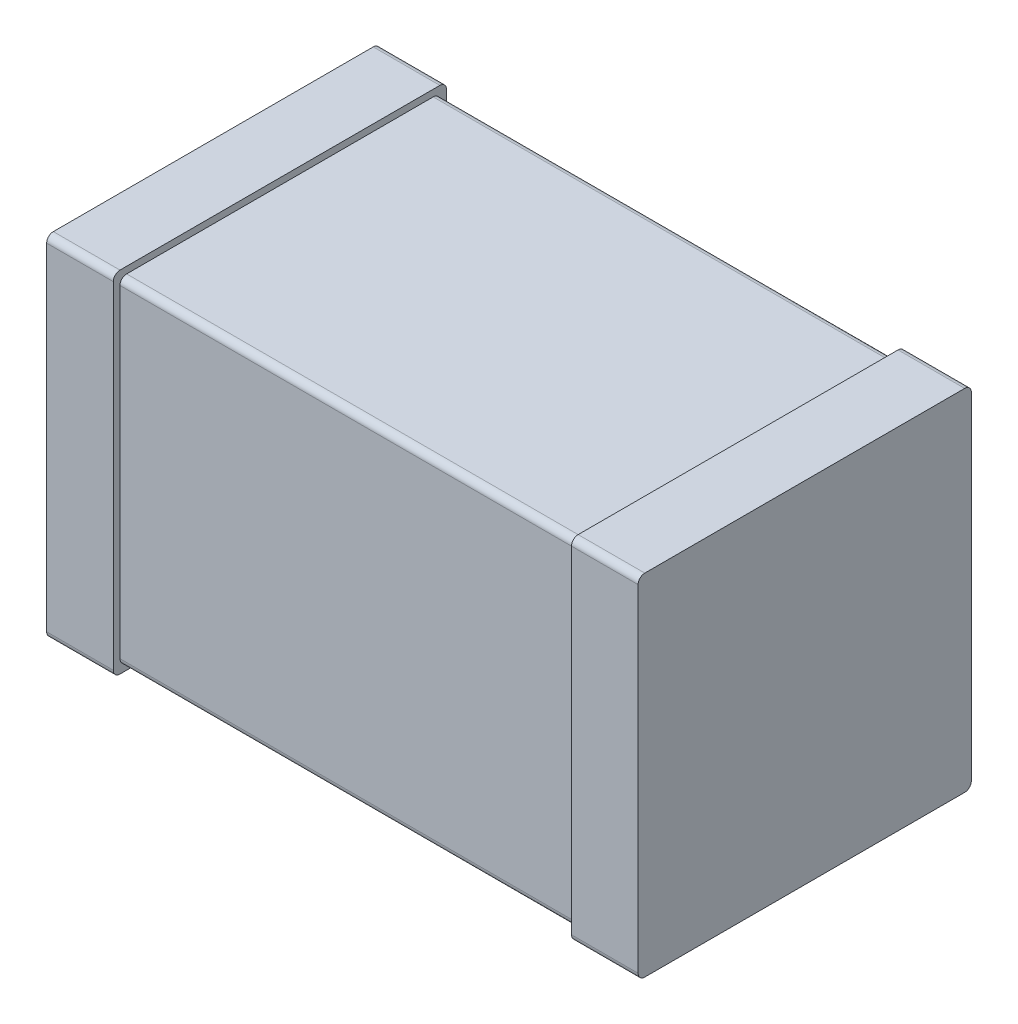
ISO-10303-21;
HEADER;
FILE_DESCRIPTION(('STEP AP214'),'2;1');
FILE_NAME('part.step','',(''),(''),'','','');
FILE_SCHEMA(('AUTOMOTIVE_DESIGN { 1 0 10303 214 1 1 1 1 }'));
ENDSEC;
DATA;
#1=APPLICATION_CONTEXT('core data for automotive mechanical design processes');
#2=APPLICATION_PROTOCOL_DEFINITION('international standard','automotive_design',2000,#1);
#3=PRODUCT_CONTEXT('',#1,'mechanical');
#4=PRODUCT('Part','Part','',(#3));
#5=PRODUCT_RELATED_PRODUCT_CATEGORY('part','',(#4));
#6=PRODUCT_DEFINITION_FORMATION('','',#4);
#7=PRODUCT_DEFINITION_CONTEXT('part definition',#1,'design');
#8=PRODUCT_DEFINITION('design','',#6,#7);
#9=PRODUCT_DEFINITION_SHAPE('','',#8);
#10=(LENGTH_UNIT() NAMED_UNIT(*) SI_UNIT(.MILLI.,.METRE.));
#11=(NAMED_UNIT(*) PLANE_ANGLE_UNIT() SI_UNIT($,.RADIAN.));
#12=(NAMED_UNIT(*) SI_UNIT($,.STERADIAN.) SOLID_ANGLE_UNIT());
#13=UNCERTAINTY_MEASURE_WITH_UNIT(LENGTH_MEASURE(1.E-05),#10,'distance_accuracy_value','');
#14=(GEOMETRIC_REPRESENTATION_CONTEXT(3) GLOBAL_UNCERTAINTY_ASSIGNED_CONTEXT((#13)) GLOBAL_UNIT_ASSIGNED_CONTEXT((#10,
#11,#12)) REPRESENTATION_CONTEXT('',''));
#15=CARTESIAN_POINT('',(0.,0.,0.));
#16=DIRECTION('',(0.,0.,1.));
#17=DIRECTION('',(1.,0.,0.));
#18=AXIS2_PLACEMENT_3D('',#15,#16,#17);
#19=CARTESIAN_POINT('',(-3.55,-2.1,0.));
#20=DIRECTION('',(1.,0.,0.));
#21=DIRECTION('',(0.,0.,-1.));
#22=AXIS2_PLACEMENT_3D('',#19,#20,#21);
#23=PLANE('',#22);
#24=DIRECTION('',(0.,1.,0.));
#25=VECTOR('',#24,1.);
#26=CARTESIAN_POINT('',(-3.55,-2.1,4.));
#27=LINE('',#26,#25);
#28=CARTESIAN_POINT('',(-3.55,2.02,4.));
#29=VERTEX_POINT('',#28);
#30=CARTESIAN_POINT('',(-3.55,-2.02,4.));
#31=VERTEX_POINT('',#30);
#32=EDGE_CURVE('E200',#29,#31,#27,.F.);
#33=ORIENTED_EDGE('',*,*,#32,.F.);
#34=CARTESIAN_POINT('',(-3.55,2.02,3.92));
#35=DIRECTION('',(1.,0.,0.));
#36=DIRECTION('',(0.,0.,-1.));
#37=AXIS2_PLACEMENT_3D('',#34,#35,#36);
#38=CIRCLE('',#37,0.08);
#39=CARTESIAN_POINT('',(-3.55,2.1,3.92));
#40=VERTEX_POINT('',#39);
#41=EDGE_CURVE('E209',#40,#29,#38,.T.);
#42=ORIENTED_EDGE('',*,*,#41,.F.);
#43=DIRECTION('',(0.,0.,1.));
#44=VECTOR('',#43,1.);
#45=CARTESIAN_POINT('',(-3.55,2.1,0.));
#46=LINE('',#45,#44);
#47=CARTESIAN_POINT('',(-3.55,2.1,0.08));
#48=VERTEX_POINT('',#47);
#49=EDGE_CURVE('E213',#48,#40,#46,.T.);
#50=ORIENTED_EDGE('',*,*,#49,.F.);
#51=CARTESIAN_POINT('',(-3.55,2.02,0.08));
#52=DIRECTION('',(1.,0.,0.));
#53=DIRECTION('',(0.,0.,-1.));
#54=AXIS2_PLACEMENT_3D('',#51,#52,#53);
#55=CIRCLE('',#54,0.08);
#56=CARTESIAN_POINT('',(-3.55,2.02,0.));
#57=VERTEX_POINT('',#56);
#58=EDGE_CURVE('E214',#57,#48,#55,.T.);
#59=ORIENTED_EDGE('',*,*,#58,.F.);
#60=DIRECTION('',(0.,1.,0.));
#61=VECTOR('',#60,1.);
#62=CARTESIAN_POINT('',(-3.55,-2.1,0.));
#63=LINE('',#62,#61);
#64=CARTESIAN_POINT('',(-3.55,-2.02,0.));
#65=VERTEX_POINT('',#64);
#66=EDGE_CURVE('E221',#57,#65,#63,.F.);
#67=ORIENTED_EDGE('',*,*,#66,.T.);
#68=CARTESIAN_POINT('',(-3.55,-2.02,0.08));
#69=DIRECTION('',(1.,0.,0.));
#70=DIRECTION('',(0.,0.,-1.));
#71=AXIS2_PLACEMENT_3D('',#68,#69,#70);
#72=CIRCLE('',#71,0.08);
#73=CARTESIAN_POINT('',(-3.55,-2.1,0.08));
#74=VERTEX_POINT('',#73);
#75=EDGE_CURVE('E186',#74,#65,#72,.T.);
#76=ORIENTED_EDGE('',*,*,#75,.F.);
#77=DIRECTION('',(0.,0.,1.));
#78=VECTOR('',#77,1.);
#79=CARTESIAN_POINT('',(-3.55,-2.1,0.));
#80=LINE('',#79,#78);
#81=CARTESIAN_POINT('',(-3.55,-2.1,3.92));
#82=VERTEX_POINT('',#81);
#83=EDGE_CURVE('E184',#74,#82,#80,.T.);
#84=ORIENTED_EDGE('',*,*,#83,.T.);
#85=CARTESIAN_POINT('',(-3.55,-2.02,3.92));
#86=DIRECTION('',(1.,0.,0.));
#87=DIRECTION('',(0.,0.,-1.));
#88=AXIS2_PLACEMENT_3D('',#85,#86,#87);
#89=CIRCLE('',#88,0.08);
#90=EDGE_CURVE('E20',#31,#82,#89,.T.);
#91=ORIENTED_EDGE('',*,*,#90,.F.);
#92=EDGE_LOOP('',(#33,#42,#50,#59,#67,#76,#84,#91));
#93=FACE_BOUND('',#92,.T.);
#94=ADVANCED_FACE('F17',(#93),#23,.F.);
#95=CARTESIAN_POINT('',(3.55,-2.1,0.));
#96=DIRECTION('',(1.,0.,0.));
#97=DIRECTION('',(0.,0.,-1.));
#98=AXIS2_PLACEMENT_3D('',#95,#96,#97);
#99=PLANE('',#98);
#100=DIRECTION('',(0.,1.,0.));
#101=VECTOR('',#100,1.);
#102=CARTESIAN_POINT('',(3.55,-2.1,4.));
#103=LINE('',#102,#101);
#104=CARTESIAN_POINT('',(3.55,-2.02,4.));
#105=VERTEX_POINT('',#104);
#106=CARTESIAN_POINT('',(3.55,2.02,4.));
#107=VERTEX_POINT('',#106);
#108=EDGE_CURVE('E224',#105,#107,#103,.T.);
#109=ORIENTED_EDGE('',*,*,#108,.F.);
#110=CARTESIAN_POINT('',(3.55,-2.02,3.92));
#111=DIRECTION('',(1.,0.,0.));
#112=DIRECTION('',(0.,0.,-1.));
#113=AXIS2_PLACEMENT_3D('',#110,#111,#112);
#114=CIRCLE('',#113,0.08);
#115=CARTESIAN_POINT('',(3.55,-2.1,3.92));
#116=VERTEX_POINT('',#115);
#117=EDGE_CURVE('E182',#105,#116,#114,.T.);
#118=ORIENTED_EDGE('',*,*,#117,.T.);
#119=DIRECTION('',(0.,0.,1.));
#120=VECTOR('',#119,1.);
#121=CARTESIAN_POINT('',(3.55,-2.1,0.));
#122=LINE('',#121,#120);
#123=CARTESIAN_POINT('',(3.55,-2.1,0.08));
#124=VERTEX_POINT('',#123);
#125=EDGE_CURVE('E197',#116,#124,#122,.F.);
#126=ORIENTED_EDGE('',*,*,#125,.T.);
#127=CARTESIAN_POINT('',(3.55,-2.02,0.08));
#128=DIRECTION('',(1.,0.,0.));
#129=DIRECTION('',(0.,0.,-1.));
#130=AXIS2_PLACEMENT_3D('',#127,#128,#129);
#131=CIRCLE('',#130,0.08);
#132=CARTESIAN_POINT('',(3.55,-2.02,0.));
#133=VERTEX_POINT('',#132);
#134=EDGE_CURVE('E230',#133,#124,#131,.F.);
#135=ORIENTED_EDGE('',*,*,#134,.F.);
#136=DIRECTION('',(0.,1.,0.));
#137=VECTOR('',#136,1.);
#138=CARTESIAN_POINT('',(3.55,-2.1,0.));
#139=LINE('',#138,#137);
#140=CARTESIAN_POINT('',(3.55,2.02,0.));
#141=VERTEX_POINT('',#140);
#142=EDGE_CURVE('E235',#133,#141,#139,.T.);
#143=ORIENTED_EDGE('',*,*,#142,.T.);
#144=CARTESIAN_POINT('',(3.55,2.02,0.08));
#145=DIRECTION('',(1.,0.,0.));
#146=DIRECTION('',(0.,0.,-1.));
#147=AXIS2_PLACEMENT_3D('',#144,#145,#146);
#148=CIRCLE('',#147,0.08);
#149=CARTESIAN_POINT('',(3.55,2.1,0.08));
#150=VERTEX_POINT('',#149);
#151=EDGE_CURVE('E238',#150,#141,#148,.F.);
#152=ORIENTED_EDGE('',*,*,#151,.F.);
#153=DIRECTION('',(0.,0.,1.));
#154=VECTOR('',#153,1.);
#155=CARTESIAN_POINT('',(3.55,2.1,0.));
#156=LINE('',#155,#154);
#157=CARTESIAN_POINT('',(3.55,2.1,3.92));
#158=VERTEX_POINT('',#157);
#159=EDGE_CURVE('E231',#158,#150,#156,.F.);
#160=ORIENTED_EDGE('',*,*,#159,.F.);
#161=CARTESIAN_POINT('',(3.55,2.02,3.92));
#162=DIRECTION('',(1.,0.,0.));
#163=DIRECTION('',(0.,0.,-1.));
#164=AXIS2_PLACEMENT_3D('',#161,#162,#163);
#165=CIRCLE('',#164,0.08);
#166=EDGE_CURVE('E285',#107,#158,#165,.F.);
#167=ORIENTED_EDGE('',*,*,#166,.F.);
#168=EDGE_LOOP('',(#109,#118,#126,#135,#143,#152,#160,#167));
#169=FACE_BOUND('',#168,.T.);
#170=ADVANCED_FACE('F301',(#169),#99,.T.);
#171=CARTESIAN_POINT('',(-2.75,-1.94,3.84));
#172=DIRECTION('',(1.,0.,0.));
#173=DIRECTION('',(0.,0.,-1.));
#174=AXIS2_PLACEMENT_3D('',#171,#172,#173);
#175=CYLINDRICAL_SURFACE('',#174,0.08);
#176=DIRECTION('',(1.,0.,0.));
#177=VECTOR('',#176,1.);
#178=CARTESIAN_POINT('',(-2.75,-1.94,3.92));
#179=LINE('',#178,#177);
#180=CARTESIAN_POINT('',(-2.75,-1.94,3.92));
#181=VERTEX_POINT('',#180);
#182=CARTESIAN_POINT('',(2.75,-1.94,3.92));
#183=VERTEX_POINT('',#182);
#184=EDGE_CURVE('E362',#181,#183,#179,.T.);
#185=ORIENTED_EDGE('',*,*,#184,.F.);
#186=CARTESIAN_POINT('',(-2.75,-1.94,3.84));
#187=DIRECTION('',(1.,0.,0.));
#188=DIRECTION('',(0.,0.,-1.));
#189=AXIS2_PLACEMENT_3D('',#186,#187,#188);
#190=CIRCLE('',#189,0.08);
#191=CARTESIAN_POINT('',(-2.75,-2.02,3.84));
#192=VERTEX_POINT('',#191);
#193=EDGE_CURVE('E295',#181,#192,#190,.T.);
#194=ORIENTED_EDGE('',*,*,#193,.T.);
#195=DIRECTION('',(1.,0.,0.));
#196=VECTOR('',#195,1.);
#197=CARTESIAN_POINT('',(-2.75,-2.02,3.84));
#198=LINE('',#197,#196);
#199=CARTESIAN_POINT('',(2.75,-2.02,3.84));
#200=VERTEX_POINT('',#199);
#201=EDGE_CURVE('E316',#192,#200,#198,.T.);
#202=ORIENTED_EDGE('',*,*,#201,.T.);
#203=CARTESIAN_POINT('',(2.75,-1.94,3.84));
#204=DIRECTION('',(1.,0.,0.));
#205=DIRECTION('',(0.,0.,-1.));
#206=AXIS2_PLACEMENT_3D('',#203,#204,#205);
#207=CIRCLE('',#206,0.08);
#208=EDGE_CURVE('E297',#200,#183,#207,.F.);
#209=ORIENTED_EDGE('',*,*,#208,.T.);
#210=EDGE_LOOP('',(#185,#194,#202,#209));
#211=FACE_BOUND('',#210,.T.);
#212=ADVANCED_FACE('F372',(#211),#175,.T.);
#213=CARTESIAN_POINT('',(-2.75,1.94,3.84));
#214=DIRECTION('',(1.,0.,0.));
#215=DIRECTION('',(0.,0.,-1.));
#216=AXIS2_PLACEMENT_3D('',#213,#214,#215);
#217=CYLINDRICAL_SURFACE('',#216,0.08);
#218=CARTESIAN_POINT('',(2.75,1.94,3.84));
#219=DIRECTION('',(1.,0.,0.));
#220=DIRECTION('',(0.,0.,-1.));
#221=AXIS2_PLACEMENT_3D('',#218,#219,#220);
#222=CIRCLE('',#221,0.08);
#223=CARTESIAN_POINT('',(2.75,1.94,3.92));
#224=VERTEX_POINT('',#223);
#225=CARTESIAN_POINT('',(2.75,2.02,3.84));
#226=VERTEX_POINT('',#225);
#227=EDGE_CURVE('E190',#224,#226,#222,.F.);
#228=ORIENTED_EDGE('',*,*,#227,.T.);
#229=DIRECTION('',(1.,0.,0.));
#230=VECTOR('',#229,1.);
#231=CARTESIAN_POINT('',(-2.75,2.02,3.84));
#232=LINE('',#231,#230);
#233=CARTESIAN_POINT('',(-2.75,2.02,3.84));
#234=VERTEX_POINT('',#233);
#235=EDGE_CURVE('E356',#234,#226,#232,.T.);
#236=ORIENTED_EDGE('',*,*,#235,.F.);
#237=CARTESIAN_POINT('',(-2.75,1.94,3.84));
#238=DIRECTION('',(1.,0.,0.));
#239=DIRECTION('',(0.,0.,-1.));
#240=AXIS2_PLACEMENT_3D('',#237,#238,#239);
#241=CIRCLE('',#240,0.08);
#242=CARTESIAN_POINT('',(-2.75,1.94,3.92));
#243=VERTEX_POINT('',#242);
#244=EDGE_CURVE('E293',#234,#243,#241,.T.);
#245=ORIENTED_EDGE('',*,*,#244,.T.);
#246=DIRECTION('',(1.,0.,0.));
#247=VECTOR('',#246,1.);
#248=CARTESIAN_POINT('',(-2.75,1.94,3.92));
#249=LINE('',#248,#247);
#250=EDGE_CURVE('E361',#224,#243,#249,.F.);
#251=ORIENTED_EDGE('',*,*,#250,.F.);
#252=EDGE_LOOP('',(#228,#236,#245,#251));
#253=FACE_BOUND('',#252,.T.);
#254=ADVANCED_FACE('F653',(#253),#217,.T.);
#255=CARTESIAN_POINT('',(-3.55,-2.1,0.));
#256=DIRECTION('',(0.,1.,0.));
#257=DIRECTION('',(0.,0.,1.));
#258=AXIS2_PLACEMENT_3D('',#255,#256,#257);
#259=PLANE('',#258);
#260=ORIENTED_EDGE('',*,*,#83,.F.);
#261=DIRECTION('',(1.,0.,0.));
#262=VECTOR('',#261,1.);
#263=CARTESIAN_POINT('',(-3.55,-2.1,0.08));
#264=LINE('',#263,#262);
#265=CARTESIAN_POINT('',(-2.75,-2.1,0.08));
#266=VERTEX_POINT('',#265);
#267=EDGE_CURVE('E222',#266,#74,#264,.F.);
#268=ORIENTED_EDGE('',*,*,#267,.F.);
#269=DIRECTION('',(0.,0.,-1.));
#270=VECTOR('',#269,1.);
#271=CARTESIAN_POINT('',(-2.75,-2.1,0.));
#272=LINE('',#271,#270);
#273=CARTESIAN_POINT('',(-2.75,-2.1,3.92));
#274=VERTEX_POINT('',#273);
#275=EDGE_CURVE('E194',#274,#266,#272,.T.);
#276=ORIENTED_EDGE('',*,*,#275,.F.);
#277=DIRECTION('',(1.,0.,0.));
#278=VECTOR('',#277,1.);
#279=CARTESIAN_POINT('',(-3.55,-2.1,3.92));
#280=LINE('',#279,#278);
#281=EDGE_CURVE('E178',#82,#274,#280,.T.);
#282=ORIENTED_EDGE('',*,*,#281,.F.);
#283=EDGE_LOOP('',(#260,#268,#276,#282));
#284=FACE_BOUND('',#283,.T.);
#285=ADVANCED_FACE('F193',(#284),#259,.F.);
#286=CARTESIAN_POINT('',(-3.55,-2.02,0.08));
#287=DIRECTION('',(1.,0.,0.));
#288=DIRECTION('',(0.,0.,-1.));
#289=AXIS2_PLACEMENT_3D('',#286,#287,#288);
#290=CYLINDRICAL_SURFACE('',#289,0.08);
#291=CARTESIAN_POINT('',(-2.75,-2.02,0.08));
#292=DIRECTION('',(1.,0.,0.));
#293=DIRECTION('',(0.,0.,-1.));
#294=AXIS2_PLACEMENT_3D('',#291,#292,#293);
#295=CIRCLE('',#294,0.08);
#296=CARTESIAN_POINT('',(-2.75,-2.02,0.));
#297=VERTEX_POINT('',#296);
#298=EDGE_CURVE('E283',#266,#297,#295,.T.);
#299=ORIENTED_EDGE('',*,*,#298,.F.);
#300=ORIENTED_EDGE('',*,*,#267,.T.);
#301=ORIENTED_EDGE('',*,*,#75,.T.);
#302=DIRECTION('',(1.,0.,0.));
#303=VECTOR('',#302,1.);
#304=CARTESIAN_POINT('',(-3.55,-2.02,0.));
#305=LINE('',#304,#303);
#306=EDGE_CURVE('E218',#65,#297,#305,.T.);
#307=ORIENTED_EDGE('',*,*,#306,.T.);
#308=EDGE_LOOP('',(#299,#300,#301,#307));
#309=FACE_BOUND('',#308,.T.);
#310=ADVANCED_FACE('F636',(#309),#290,.T.);
#311=CARTESIAN_POINT('',(-3.55,-2.1,0.));
#312=DIRECTION('',(0.,0.,1.));
#313=DIRECTION('',(1.,0.,0.));
#314=AXIS2_PLACEMENT_3D('',#311,#312,#313);
#315=PLANE('',#314);
#316=DIRECTION('',(0.,1.,0.));
#317=VECTOR('',#316,1.);
#318=CARTESIAN_POINT('',(-2.75,-2.1,0.));
#319=LINE('',#318,#317);
#320=CARTESIAN_POINT('',(-2.75,2.02,0.));
#321=VERTEX_POINT('',#320);
#322=EDGE_CURVE('E282',#297,#321,#319,.T.);
#323=ORIENTED_EDGE('',*,*,#322,.F.);
#324=ORIENTED_EDGE('',*,*,#306,.F.);
#325=ORIENTED_EDGE('',*,*,#66,.F.);
#326=DIRECTION('',(1.,0.,0.));
#327=VECTOR('',#326,1.);
#328=CARTESIAN_POINT('',(-3.55,2.02,0.));
#329=LINE('',#328,#327);
#330=EDGE_CURVE('E215',#321,#57,#329,.F.);
#331=ORIENTED_EDGE('',*,*,#330,.F.);
#332=EDGE_LOOP('',(#323,#324,#325,#331));
#333=FACE_BOUND('',#332,.T.);
#334=ADVANCED_FACE('F627',(#333),#315,.F.);
#335=CARTESIAN_POINT('',(-3.55,2.02,0.08));
#336=DIRECTION('',(1.,0.,0.));
#337=DIRECTION('',(0.,0.,-1.));
#338=AXIS2_PLACEMENT_3D('',#335,#336,#337);
#339=CYLINDRICAL_SURFACE('',#338,0.08);
#340=ORIENTED_EDGE('',*,*,#330,.T.);
#341=ORIENTED_EDGE('',*,*,#58,.T.);
#342=DIRECTION('',(1.,0.,0.));
#343=VECTOR('',#342,1.);
#344=CARTESIAN_POINT('',(-3.55,2.1,0.08));
#345=LINE('',#344,#343);
#346=CARTESIAN_POINT('',(-2.75,2.1,0.08));
#347=VERTEX_POINT('',#346);
#348=EDGE_CURVE('E210',#347,#48,#345,.F.);
#349=ORIENTED_EDGE('',*,*,#348,.F.);
#350=CARTESIAN_POINT('',(-2.75,2.02,0.08));
#351=DIRECTION('',(1.,0.,0.));
#352=DIRECTION('',(0.,0.,-1.));
#353=AXIS2_PLACEMENT_3D('',#350,#351,#352);
#354=CIRCLE('',#353,0.08);
#355=EDGE_CURVE('E280',#321,#347,#354,.T.);
#356=ORIENTED_EDGE('',*,*,#355,.F.);
#357=EDGE_LOOP('',(#340,#341,#349,#356));
#358=FACE_BOUND('',#357,.T.);
#359=ADVANCED_FACE('F618',(#358),#339,.T.);
#360=CARTESIAN_POINT('',(-3.55,2.1,0.));
#361=DIRECTION('',(0.,1.,0.));
#362=DIRECTION('',(0.,0.,1.));
#363=AXIS2_PLACEMENT_3D('',#360,#361,#362);
#364=PLANE('',#363);
#365=ORIENTED_EDGE('',*,*,#49,.T.);
#366=DIRECTION('',(1.,0.,0.));
#367=VECTOR('',#366,1.);
#368=CARTESIAN_POINT('',(-3.55,2.1,3.92));
#369=LINE('',#368,#367);
#370=CARTESIAN_POINT('',(-2.75,2.1,3.92));
#371=VERTEX_POINT('',#370);
#372=EDGE_CURVE('E206',#371,#40,#369,.F.);
#373=ORIENTED_EDGE('',*,*,#372,.F.);
#374=DIRECTION('',(0.,0.,-1.));
#375=VECTOR('',#374,1.);
#376=CARTESIAN_POINT('',(-2.75,2.1,0.));
#377=LINE('',#376,#375);
#378=EDGE_CURVE('E279',#347,#371,#377,.F.);
#379=ORIENTED_EDGE('',*,*,#378,.F.);
#380=ORIENTED_EDGE('',*,*,#348,.T.);
#381=EDGE_LOOP('',(#365,#373,#379,#380));
#382=FACE_BOUND('',#381,.T.);
#383=ADVANCED_FACE('F609',(#382),#364,.T.);
#384=CARTESIAN_POINT('',(-3.55,2.02,3.92));
#385=DIRECTION('',(1.,0.,0.));
#386=DIRECTION('',(0.,0.,-1.));
#387=AXIS2_PLACEMENT_3D('',#384,#385,#386);
#388=CYLINDRICAL_SURFACE('',#387,0.08);
#389=CARTESIAN_POINT('',(-2.75,2.02,3.92));
#390=DIRECTION('',(1.,0.,0.));
#391=DIRECTION('',(0.,0.,-1.));
#392=AXIS2_PLACEMENT_3D('',#389,#390,#391);
#393=CIRCLE('',#392,0.08);
#394=CARTESIAN_POINT('',(-2.75,2.02,4.));
#395=VERTEX_POINT('',#394);
#396=EDGE_CURVE('E277',#371,#395,#393,.T.);
#397=ORIENTED_EDGE('',*,*,#396,.F.);
#398=ORIENTED_EDGE('',*,*,#372,.T.);
#399=ORIENTED_EDGE('',*,*,#41,.T.);
#400=DIRECTION('',(1.,0.,0.));
#401=VECTOR('',#400,1.);
#402=CARTESIAN_POINT('',(-3.55,2.02,4.));
#403=LINE('',#402,#401);
#404=EDGE_CURVE('E195',#395,#29,#403,.F.);
#405=ORIENTED_EDGE('',*,*,#404,.F.);
#406=EDGE_LOOP('',(#397,#398,#399,#405));
#407=FACE_BOUND('',#406,.T.);
#408=ADVANCED_FACE('F600',(#407),#388,.T.);
#409=CARTESIAN_POINT('',(-3.55,-2.1,4.));
#410=DIRECTION('',(0.,0.,1.));
#411=DIRECTION('',(1.,0.,0.));
#412=AXIS2_PLACEMENT_3D('',#409,#410,#411);
#413=PLANE('',#412);
#414=DIRECTION('',(0.,1.,0.));
#415=VECTOR('',#414,1.);
#416=CARTESIAN_POINT('',(-2.75,-2.1,4.));
#417=LINE('',#416,#415);
#418=CARTESIAN_POINT('',(-2.75,-2.02,4.));
#419=VERTEX_POINT('',#418);
#420=EDGE_CURVE('E276',#395,#419,#417,.F.);
#421=ORIENTED_EDGE('',*,*,#420,.F.);
#422=ORIENTED_EDGE('',*,*,#404,.T.);
#423=ORIENTED_EDGE('',*,*,#32,.T.);
#424=DIRECTION('',(1.,0.,0.));
#425=VECTOR('',#424,1.);
#426=CARTESIAN_POINT('',(-3.55,-2.02,4.));
#427=LINE('',#426,#425);
#428=EDGE_CURVE('E181',#419,#31,#427,.F.);
#429=ORIENTED_EDGE('',*,*,#428,.F.);
#430=EDGE_LOOP('',(#421,#422,#423,#429));
#431=FACE_BOUND('',#430,.T.);
#432=ADVANCED_FACE('F592',(#431),#413,.T.);
#433=CARTESIAN_POINT('',(-3.55,-2.02,3.92));
#434=DIRECTION('',(1.,0.,0.));
#435=DIRECTION('',(0.,0.,-1.));
#436=AXIS2_PLACEMENT_3D('',#433,#434,#435);
#437=CYLINDRICAL_SURFACE('',#436,0.08);
#438=ORIENTED_EDGE('',*,*,#428,.T.);
#439=ORIENTED_EDGE('',*,*,#90,.T.);
#440=ORIENTED_EDGE('',*,*,#281,.T.);
#441=CARTESIAN_POINT('',(-2.75,-2.02,3.92));
#442=DIRECTION('',(1.,0.,0.));
#443=DIRECTION('',(0.,0.,-1.));
#444=AXIS2_PLACEMENT_3D('',#441,#442,#443);
#445=CIRCLE('',#444,0.08);
#446=EDGE_CURVE('E273',#419,#274,#445,.T.);
#447=ORIENTED_EDGE('',*,*,#446,.F.);
#448=EDGE_LOOP('',(#438,#439,#440,#447));
#449=FACE_BOUND('',#448,.T.);
#450=ADVANCED_FACE('F175',(#449),#437,.T.);
#451=CARTESIAN_POINT('',(2.75,-2.1,0.));
#452=DIRECTION('',(0.,1.,0.));
#453=DIRECTION('',(0.,0.,1.));
#454=AXIS2_PLACEMENT_3D('',#451,#452,#453);
#455=PLANE('',#454);
#456=DIRECTION('',(0.,0.,-1.));
#457=VECTOR('',#456,1.);
#458=CARTESIAN_POINT('',(2.75,-2.1,0.));
#459=LINE('',#458,#457);
#460=CARTESIAN_POINT('',(2.75,-2.1,3.92));
#461=VERTEX_POINT('',#460);
#462=CARTESIAN_POINT('',(2.75,-2.1,0.08));
#463=VERTEX_POINT('',#462);
#464=EDGE_CURVE('E268',#461,#463,#459,.T.);
#465=ORIENTED_EDGE('',*,*,#464,.T.);
#466=DIRECTION('',(1.,0.,0.));
#467=VECTOR('',#466,1.);
#468=CARTESIAN_POINT('',(2.75,-2.1,0.08));
#469=LINE('',#468,#467);
#470=EDGE_CURVE('E203',#124,#463,#469,.F.);
#471=ORIENTED_EDGE('',*,*,#470,.F.);
#472=ORIENTED_EDGE('',*,*,#125,.F.);
#473=DIRECTION('',(1.,0.,0.));
#474=VECTOR('',#473,1.);
#475=CARTESIAN_POINT('',(2.75,-2.1,3.92));
#476=LINE('',#475,#474);
#477=EDGE_CURVE('E311',#461,#116,#476,.T.);
#478=ORIENTED_EDGE('',*,*,#477,.F.);
#479=EDGE_LOOP('',(#465,#471,#472,#478));
#480=FACE_BOUND('',#479,.T.);
#481=ADVANCED_FACE('F310',(#480),#455,.F.);
#482=CARTESIAN_POINT('',(2.75,-2.02,0.08));
#483=DIRECTION('',(1.,0.,0.));
#484=DIRECTION('',(0.,0.,-1.));
#485=AXIS2_PLACEMENT_3D('',#482,#483,#484);
#486=CYLINDRICAL_SURFACE('',#485,0.08);
#487=ORIENTED_EDGE('',*,*,#134,.T.);
#488=ORIENTED_EDGE('',*,*,#470,.T.);
#489=CARTESIAN_POINT('',(2.75,-2.02,0.08));
#490=DIRECTION('',(1.,0.,0.));
#491=DIRECTION('',(0.,0.,-1.));
#492=AXIS2_PLACEMENT_3D('',#489,#490,#491);
#493=CIRCLE('',#492,0.08);
#494=CARTESIAN_POINT('',(2.75,-2.02,0.));
#495=VERTEX_POINT('',#494);
#496=EDGE_CURVE('E265',#463,#495,#493,.T.);
#497=ORIENTED_EDGE('',*,*,#496,.T.);
#498=DIRECTION('',(1.,0.,0.));
#499=VECTOR('',#498,1.);
#500=CARTESIAN_POINT('',(2.75,-2.02,0.));
#501=LINE('',#500,#499);
#502=EDGE_CURVE('E239',#495,#133,#501,.T.);
#503=ORIENTED_EDGE('',*,*,#502,.T.);
#504=EDGE_LOOP('',(#487,#488,#497,#503));
#505=FACE_BOUND('',#504,.T.);
#506=ADVANCED_FACE('F326',(#505),#486,.T.);
#507=CARTESIAN_POINT('',(2.75,-2.1,0.));
#508=DIRECTION('',(0.,0.,1.));
#509=DIRECTION('',(1.,0.,0.));
#510=AXIS2_PLACEMENT_3D('',#507,#508,#509);
#511=PLANE('',#510);
#512=ORIENTED_EDGE('',*,*,#142,.F.);
#513=ORIENTED_EDGE('',*,*,#502,.F.);
#514=DIRECTION('',(0.,1.,0.));
#515=VECTOR('',#514,1.);
#516=CARTESIAN_POINT('',(2.75,-2.1,0.));
#517=LINE('',#516,#515);
#518=CARTESIAN_POINT('',(2.75,2.02,0.));
#519=VERTEX_POINT('',#518);
#520=EDGE_CURVE('E264',#495,#519,#517,.T.);
#521=ORIENTED_EDGE('',*,*,#520,.T.);
#522=DIRECTION('',(1.,0.,0.));
#523=VECTOR('',#522,1.);
#524=CARTESIAN_POINT('',(2.75,2.02,0.));
#525=LINE('',#524,#523);
#526=EDGE_CURVE('E234',#141,#519,#525,.F.);
#527=ORIENTED_EDGE('',*,*,#526,.F.);
#528=EDGE_LOOP('',(#512,#513,#521,#527));
#529=FACE_BOUND('',#528,.T.);
#530=ADVANCED_FACE('F397',(#529),#511,.F.);
#531=CARTESIAN_POINT('',(2.75,2.02,0.08));
#532=DIRECTION('',(1.,0.,0.));
#533=DIRECTION('',(0.,0.,-1.));
#534=AXIS2_PLACEMENT_3D('',#531,#532,#533);
#535=CYLINDRICAL_SURFACE('',#534,0.08);
#536=ORIENTED_EDGE('',*,*,#526,.T.);
#537=CARTESIAN_POINT('',(2.75,2.02,0.08));
#538=DIRECTION('',(1.,0.,0.));
#539=DIRECTION('',(0.,0.,-1.));
#540=AXIS2_PLACEMENT_3D('',#537,#538,#539);
#541=CIRCLE('',#540,0.08);
#542=CARTESIAN_POINT('',(2.75,2.1,0.08));
#543=VERTEX_POINT('',#542);
#544=EDGE_CURVE('E261',#519,#543,#541,.T.);
#545=ORIENTED_EDGE('',*,*,#544,.T.);
#546=DIRECTION('',(1.,0.,0.));
#547=VECTOR('',#546,1.);
#548=CARTESIAN_POINT('',(2.75,2.1,0.08));
#549=LINE('',#548,#547);
#550=EDGE_CURVE('E233',#150,#543,#549,.F.);
#551=ORIENTED_EDGE('',*,*,#550,.F.);
#552=ORIENTED_EDGE('',*,*,#151,.T.);
#553=EDGE_LOOP('',(#536,#545,#551,#552));
#554=FACE_BOUND('',#553,.T.);
#555=ADVANCED_FACE('F392',(#554),#535,.T.);
#556=CARTESIAN_POINT('',(2.75,2.1,0.));
#557=DIRECTION('',(0.,1.,0.));
#558=DIRECTION('',(0.,0.,1.));
#559=AXIS2_PLACEMENT_3D('',#556,#557,#558);
#560=PLANE('',#559);
#561=DIRECTION('',(0.,0.,-1.));
#562=VECTOR('',#561,1.);
#563=CARTESIAN_POINT('',(2.75,2.1,0.));
#564=LINE('',#563,#562);
#565=CARTESIAN_POINT('',(2.75,2.1,3.92));
#566=VERTEX_POINT('',#565);
#567=EDGE_CURVE('E260',#543,#566,#564,.F.);
#568=ORIENTED_EDGE('',*,*,#567,.T.);
#569=DIRECTION('',(1.,0.,0.));
#570=VECTOR('',#569,1.);
#571=CARTESIAN_POINT('',(2.75,2.1,3.92));
#572=LINE('',#571,#570);
#573=EDGE_CURVE('E227',#158,#566,#572,.F.);
#574=ORIENTED_EDGE('',*,*,#573,.F.);
#575=ORIENTED_EDGE('',*,*,#159,.T.);
#576=ORIENTED_EDGE('',*,*,#550,.T.);
#577=EDGE_LOOP('',(#568,#574,#575,#576));
#578=FACE_BOUND('',#577,.T.);
#579=ADVANCED_FACE('F388',(#578),#560,.T.);
#580=CARTESIAN_POINT('',(2.75,2.02,3.92));
#581=DIRECTION('',(1.,0.,0.));
#582=DIRECTION('',(0.,0.,-1.));
#583=AXIS2_PLACEMENT_3D('',#580,#581,#582);
#584=CYLINDRICAL_SURFACE('',#583,0.08);
#585=ORIENTED_EDGE('',*,*,#166,.T.);
#586=ORIENTED_EDGE('',*,*,#573,.T.);
#587=CARTESIAN_POINT('',(2.75,2.02,3.92));
#588=DIRECTION('',(1.,0.,0.));
#589=DIRECTION('',(0.,0.,-1.));
#590=AXIS2_PLACEMENT_3D('',#587,#588,#589);
#591=CIRCLE('',#590,0.08);
#592=CARTESIAN_POINT('',(2.75,2.02,4.));
#593=VERTEX_POINT('',#592);
#594=EDGE_CURVE('E257',#566,#593,#591,.T.);
#595=ORIENTED_EDGE('',*,*,#594,.T.);
#596=DIRECTION('',(1.,0.,0.));
#597=VECTOR('',#596,1.);
#598=CARTESIAN_POINT('',(2.75,2.02,4.));
#599=LINE('',#598,#597);
#600=EDGE_CURVE('E226',#107,#593,#599,.F.);
#601=ORIENTED_EDGE('',*,*,#600,.F.);
#602=EDGE_LOOP('',(#585,#586,#595,#601));
#603=FACE_BOUND('',#602,.T.);
#604=ADVANCED_FACE('F401',(#603),#584,.T.);
#605=CARTESIAN_POINT('',(2.75,-2.1,4.));
#606=DIRECTION('',(0.,0.,1.));
#607=DIRECTION('',(1.,0.,0.));
#608=AXIS2_PLACEMENT_3D('',#605,#606,#607);
#609=PLANE('',#608);
#610=ORIENTED_EDGE('',*,*,#108,.T.);
#611=ORIENTED_EDGE('',*,*,#600,.T.);
#612=DIRECTION('',(0.,1.,0.));
#613=VECTOR('',#612,1.);
#614=CARTESIAN_POINT('',(2.75,-2.1,4.));
#615=LINE('',#614,#613);
#616=CARTESIAN_POINT('',(2.75,-2.02,4.));
#617=VERTEX_POINT('',#616);
#618=EDGE_CURVE('E256',#593,#617,#615,.F.);
#619=ORIENTED_EDGE('',*,*,#618,.T.);
#620=DIRECTION('',(1.,0.,0.));
#621=VECTOR('',#620,1.);
#622=CARTESIAN_POINT('',(2.75,-2.02,4.));
#623=LINE('',#622,#621);
#624=EDGE_CURVE('E314',#105,#617,#623,.F.);
#625=ORIENTED_EDGE('',*,*,#624,.F.);
#626=EDGE_LOOP('',(#610,#611,#619,#625));
#627=FACE_BOUND('',#626,.T.);
#628=ADVANCED_FACE('F403',(#627),#609,.T.);
#629=CARTESIAN_POINT('',(2.75,-2.02,3.92));
#630=DIRECTION('',(1.,0.,0.));
#631=DIRECTION('',(0.,0.,-1.));
#632=AXIS2_PLACEMENT_3D('',#629,#630,#631);
#633=CYLINDRICAL_SURFACE('',#632,0.08);
#634=ORIENTED_EDGE('',*,*,#624,.T.);
#635=CARTESIAN_POINT('',(2.75,-2.02,3.92));
#636=DIRECTION('',(1.,0.,0.));
#637=DIRECTION('',(0.,0.,-1.));
#638=AXIS2_PLACEMENT_3D('',#635,#636,#637);
#639=CIRCLE('',#638,0.08);
#640=EDGE_CURVE('E253',#617,#461,#639,.T.);
#641=ORIENTED_EDGE('',*,*,#640,.T.);
#642=ORIENTED_EDGE('',*,*,#477,.T.);
#643=ORIENTED_EDGE('',*,*,#117,.F.);
#644=EDGE_LOOP('',(#634,#641,#642,#643));
#645=FACE_BOUND('',#644,.T.);
#646=ADVANCED_FACE('F312',(#645),#633,.T.);
#647=CARTESIAN_POINT('',(-2.75,-2.02,0.08));
#648=DIRECTION('',(0.,1.,0.));
#649=DIRECTION('',(0.,0.,1.));
#650=AXIS2_PLACEMENT_3D('',#647,#648,#649);
#651=PLANE('',#650);
#652=DIRECTION('',(0.,0.,-1.));
#653=VECTOR('',#652,1.);
#654=CARTESIAN_POINT('',(-2.75,-2.02,0.));
#655=LINE('',#654,#653);
#656=CARTESIAN_POINT('',(-2.75,-2.02,0.16));
#657=VERTEX_POINT('',#656);
#658=EDGE_CURVE('E275',#657,#192,#655,.F.);
#659=ORIENTED_EDGE('',*,*,#658,.F.);
#660=DIRECTION('',(1.,0.,0.));
#661=VECTOR('',#660,1.);
#662=CARTESIAN_POINT('',(-2.75,-2.02,0.16));
#663=LINE('',#662,#661);
#664=CARTESIAN_POINT('',(2.75,-2.02,0.16));
#665=VERTEX_POINT('',#664);
#666=EDGE_CURVE('E271',#665,#657,#663,.F.);
#667=ORIENTED_EDGE('',*,*,#666,.F.);
#668=DIRECTION('',(0.,0.,-1.));
#669=VECTOR('',#668,1.);
#670=CARTESIAN_POINT('',(2.75,-2.02,0.));
#671=LINE('',#670,#669);
#672=EDGE_CURVE('E252',#665,#200,#671,.F.);
#673=ORIENTED_EDGE('',*,*,#672,.T.);
#674=ORIENTED_EDGE('',*,*,#201,.F.);
#675=EDGE_LOOP('',(#659,#667,#673,#674));
#676=FACE_BOUND('',#675,.T.);
#677=ADVANCED_FACE('F375',(#676),#651,.F.);
#678=CARTESIAN_POINT('',(-2.75,-2.02,3.92));
#679=DIRECTION('',(0.,0.,1.));
#680=DIRECTION('',(1.,0.,0.));
#681=AXIS2_PLACEMENT_3D('',#678,#679,#680);
#682=PLANE('',#681);
#683=DIRECTION('',(0.,1.,0.));
#684=VECTOR('',#683,1.);
#685=CARTESIAN_POINT('',(2.75,-2.1,3.92));
#686=LINE('',#685,#684);
#687=EDGE_CURVE('E377',#183,#224,#686,.T.);
#688=ORIENTED_EDGE('',*,*,#687,.T.);
#689=ORIENTED_EDGE('',*,*,#250,.T.);
#690=DIRECTION('',(0.,1.,0.));
#691=VECTOR('',#690,1.);
#692=CARTESIAN_POINT('',(-2.75,-2.1,3.92));
#693=LINE('',#692,#691);
#694=EDGE_CURVE('E347',#181,#243,#693,.T.);
#695=ORIENTED_EDGE('',*,*,#694,.F.);
#696=ORIENTED_EDGE('',*,*,#184,.T.);
#697=EDGE_LOOP('',(#688,#689,#695,#696));
#698=FACE_BOUND('',#697,.T.);
#699=ADVANCED_FACE('F437',(#698),#682,.T.);
#700=CARTESIAN_POINT('',(-2.75,2.02,0.08));
#701=DIRECTION('',(0.,1.,0.));
#702=DIRECTION('',(0.,0.,1.));
#703=AXIS2_PLACEMENT_3D('',#700,#701,#702);
#704=PLANE('',#703);
#705=DIRECTION('',(0.,0.,-1.));
#706=VECTOR('',#705,1.);
#707=CARTESIAN_POINT('',(-2.75,2.02,0.));
#708=LINE('',#707,#706);
#709=CARTESIAN_POINT('',(-2.75,2.02,0.16));
#710=VERTEX_POINT('',#709);
#711=EDGE_CURVE('E272',#234,#710,#708,.T.);
#712=ORIENTED_EDGE('',*,*,#711,.F.);
#713=ORIENTED_EDGE('',*,*,#235,.T.);
#714=DIRECTION('',(0.,0.,-1.));
#715=VECTOR('',#714,1.);
#716=CARTESIAN_POINT('',(2.75,2.02,0.));
#717=LINE('',#716,#715);
#718=CARTESIAN_POINT('',(2.75,2.02,0.16));
#719=VERTEX_POINT('',#718);
#720=EDGE_CURVE('E358',#226,#719,#717,.T.);
#721=ORIENTED_EDGE('',*,*,#720,.T.);
#722=DIRECTION('',(1.,0.,0.));
#723=VECTOR('',#722,1.);
#724=CARTESIAN_POINT('',(-2.75,2.02,0.16));
#725=LINE('',#724,#723);
#726=EDGE_CURVE('E248',#710,#719,#725,.T.);
#727=ORIENTED_EDGE('',*,*,#726,.F.);
#728=EDGE_LOOP('',(#712,#713,#721,#727));
#729=FACE_BOUND('',#728,.T.);
#730=ADVANCED_FACE('F433',(#729),#704,.T.);
#731=CARTESIAN_POINT('',(-2.75,-2.1,0.));
#732=DIRECTION('',(1.,0.,0.));
#733=DIRECTION('',(0.,0.,-1.));
#734=AXIS2_PLACEMENT_3D('',#731,#732,#733);
#735=PLANE('',#734);
#736=CARTESIAN_POINT('',(-2.75,1.94,0.16));
#737=DIRECTION('',(1.,0.,0.));
#738=DIRECTION('',(0.,0.,-1.));
#739=AXIS2_PLACEMENT_3D('',#736,#737,#738);
#740=CIRCLE('',#739,0.08);
#741=CARTESIAN_POINT('',(-2.75,1.94,0.08));
#742=VERTEX_POINT('',#741);
#743=EDGE_CURVE('E243',#742,#710,#740,.T.);
#744=ORIENTED_EDGE('',*,*,#743,.F.);
#745=DIRECTION('',(0.,1.,0.));
#746=VECTOR('',#745,1.);
#747=CARTESIAN_POINT('',(-2.75,-2.02,0.08));
#748=LINE('',#747,#746);
#749=CARTESIAN_POINT('',(-2.75,-1.94,0.08));
#750=VERTEX_POINT('',#749);
#751=EDGE_CURVE('E246',#742,#750,#748,.F.);
#752=ORIENTED_EDGE('',*,*,#751,.T.);
#753=CARTESIAN_POINT('',(-2.75,-1.94,0.16));
#754=DIRECTION('',(1.,0.,0.));
#755=DIRECTION('',(0.,0.,-1.));
#756=AXIS2_PLACEMENT_3D('',#753,#754,#755);
#757=CIRCLE('',#756,0.08);
#758=EDGE_CURVE('E269',#657,#750,#757,.T.);
#759=ORIENTED_EDGE('',*,*,#758,.F.);
#760=ORIENTED_EDGE('',*,*,#658,.T.);
#761=ORIENTED_EDGE('',*,*,#193,.F.);
#762=ORIENTED_EDGE('',*,*,#694,.T.);
#763=ORIENTED_EDGE('',*,*,#244,.F.);
#764=ORIENTED_EDGE('',*,*,#711,.T.);
#765=EDGE_LOOP('',(#744,#752,#759,#760,#761,#762,#763,#764));
#766=FACE_BOUND('',#765,.T.);
#767=ORIENTED_EDGE('',*,*,#420,.T.);
#768=ORIENTED_EDGE('',*,*,#446,.T.);
#769=ORIENTED_EDGE('',*,*,#275,.T.);
#770=ORIENTED_EDGE('',*,*,#298,.T.);
#771=ORIENTED_EDGE('',*,*,#322,.T.);
#772=ORIENTED_EDGE('',*,*,#355,.T.);
#773=ORIENTED_EDGE('',*,*,#378,.T.);
#774=ORIENTED_EDGE('',*,*,#396,.T.);
#775=EDGE_LOOP('',(#767,#768,#769,#770,#771,#772,#773,#774));
#776=FACE_BOUND('',#775,.T.);
#777=ADVANCED_FACE('F429',(#766,#776),#735,.T.);
#778=CARTESIAN_POINT('',(-2.75,-1.94,0.16));
#779=DIRECTION('',(1.,0.,0.));
#780=DIRECTION('',(0.,0.,-1.));
#781=AXIS2_PLACEMENT_3D('',#778,#779,#780);
#782=CYLINDRICAL_SURFACE('',#781,0.08);
#783=CARTESIAN_POINT('',(2.75,-1.94,0.16));
#784=DIRECTION('',(1.,0.,0.));
#785=DIRECTION('',(0.,0.,-1.));
#786=AXIS2_PLACEMENT_3D('',#783,#784,#785);
#787=CIRCLE('',#786,0.08);
#788=CARTESIAN_POINT('',(2.75,-1.94,0.08));
#789=VERTEX_POINT('',#788);
#790=EDGE_CURVE('E249',#789,#665,#787,.F.);
#791=ORIENTED_EDGE('',*,*,#790,.T.);
#792=ORIENTED_EDGE('',*,*,#666,.T.);
#793=ORIENTED_EDGE('',*,*,#758,.T.);
#794=DIRECTION('',(1.,0.,0.));
#795=VECTOR('',#794,1.);
#796=CARTESIAN_POINT('',(-2.75,-1.94,0.08));
#797=LINE('',#796,#795);
#798=EDGE_CURVE('E338',#750,#789,#797,.T.);
#799=ORIENTED_EDGE('',*,*,#798,.T.);
#800=EDGE_LOOP('',(#791,#792,#793,#799));
#801=FACE_BOUND('',#800,.T.);
#802=ADVANCED_FACE('F426',(#801),#782,.T.);
#803=CARTESIAN_POINT('',(2.75,-2.1,0.));
#804=DIRECTION('',(1.,0.,0.));
#805=DIRECTION('',(0.,0.,-1.));
#806=AXIS2_PLACEMENT_3D('',#803,#804,#805);
#807=PLANE('',#806);
#808=CARTESIAN_POINT('',(2.75,1.94,0.16));
#809=DIRECTION('',(1.,0.,0.));
#810=DIRECTION('',(0.,0.,-1.));
#811=AXIS2_PLACEMENT_3D('',#808,#809,#810);
#812=CIRCLE('',#811,0.08);
#813=CARTESIAN_POINT('',(2.75,1.94,0.08));
#814=VERTEX_POINT('',#813);
#815=EDGE_CURVE('E34',#719,#814,#812,.F.);
#816=ORIENTED_EDGE('',*,*,#815,.F.);
#817=ORIENTED_EDGE('',*,*,#720,.F.);
#818=ORIENTED_EDGE('',*,*,#227,.F.);
#819=ORIENTED_EDGE('',*,*,#687,.F.);
#820=ORIENTED_EDGE('',*,*,#208,.F.);
#821=ORIENTED_EDGE('',*,*,#672,.F.);
#822=ORIENTED_EDGE('',*,*,#790,.F.);
#823=DIRECTION('',(0.,1.,0.));
#824=VECTOR('',#823,1.);
#825=CARTESIAN_POINT('',(2.75,-2.02,0.08));
#826=LINE('',#825,#824);
#827=EDGE_CURVE('E26',#789,#814,#826,.T.);
#828=ORIENTED_EDGE('',*,*,#827,.T.);
#829=EDGE_LOOP('',(#816,#817,#818,#819,#820,#821,#822,#828));
#830=FACE_BOUND('',#829,.T.);
#831=ORIENTED_EDGE('',*,*,#618,.F.);
#832=ORIENTED_EDGE('',*,*,#594,.F.);
#833=ORIENTED_EDGE('',*,*,#567,.F.);
#834=ORIENTED_EDGE('',*,*,#544,.F.);
#835=ORIENTED_EDGE('',*,*,#520,.F.);
#836=ORIENTED_EDGE('',*,*,#496,.F.);
#837=ORIENTED_EDGE('',*,*,#464,.F.);
#838=ORIENTED_EDGE('',*,*,#640,.F.);
#839=EDGE_LOOP('',(#831,#832,#833,#834,#835,#836,#837,#838));
#840=FACE_BOUND('',#839,.T.);
#841=ADVANCED_FACE('F330',(#830,#840),#807,.F.);
#842=CARTESIAN_POINT('',(-2.75,1.94,0.16));
#843=DIRECTION('',(1.,0.,0.));
#844=DIRECTION('',(0.,0.,-1.));
#845=AXIS2_PLACEMENT_3D('',#842,#843,#844);
#846=CYLINDRICAL_SURFACE('',#845,0.08);
#847=DIRECTION('',(1.,0.,0.));
#848=VECTOR('',#847,1.);
#849=CARTESIAN_POINT('',(-2.75,1.94,0.08));
#850=LINE('',#849,#848);
#851=EDGE_CURVE('E11',#814,#742,#850,.F.);
#852=ORIENTED_EDGE('',*,*,#851,.T.);
#853=ORIENTED_EDGE('',*,*,#743,.T.);
#854=ORIENTED_EDGE('',*,*,#726,.T.);
#855=ORIENTED_EDGE('',*,*,#815,.T.);
#856=EDGE_LOOP('',(#852,#853,#854,#855));
#857=FACE_BOUND('',#856,.T.);
#858=ADVANCED_FACE('F415',(#857),#846,.T.);
#859=CARTESIAN_POINT('',(-2.75,-2.02,0.08));
#860=DIRECTION('',(0.,0.,1.));
#861=DIRECTION('',(1.,0.,0.));
#862=AXIS2_PLACEMENT_3D('',#859,#860,#861);
#863=PLANE('',#862);
#864=ORIENTED_EDGE('',*,*,#827,.F.);
#865=ORIENTED_EDGE('',*,*,#798,.F.);
#866=ORIENTED_EDGE('',*,*,#751,.F.);
#867=ORIENTED_EDGE('',*,*,#851,.F.);
#868=EDGE_LOOP('',(#864,#865,#866,#867));
#869=FACE_BOUND('',#868,.T.);
#870=ADVANCED_FACE('F413',(#869),#863,.F.);
#871=CLOSED_SHELL('',(#94,#170,#212,#254,#285,#310,#334,#359,#383,#408,#432,#450,#481,#506,#530,
#555,#579,#604,#628,#646,#677,#699,#730,#777,#802,#841,#858,#870));
#872=MANIFOLD_SOLID_BREP('B1',#871);
#873=ADVANCED_BREP_SHAPE_REPRESENTATION('',(#18,#872),#14);
#874=SHAPE_DEFINITION_REPRESENTATION(#9,#873);
ENDSEC;
END-ISO-10303-21;
